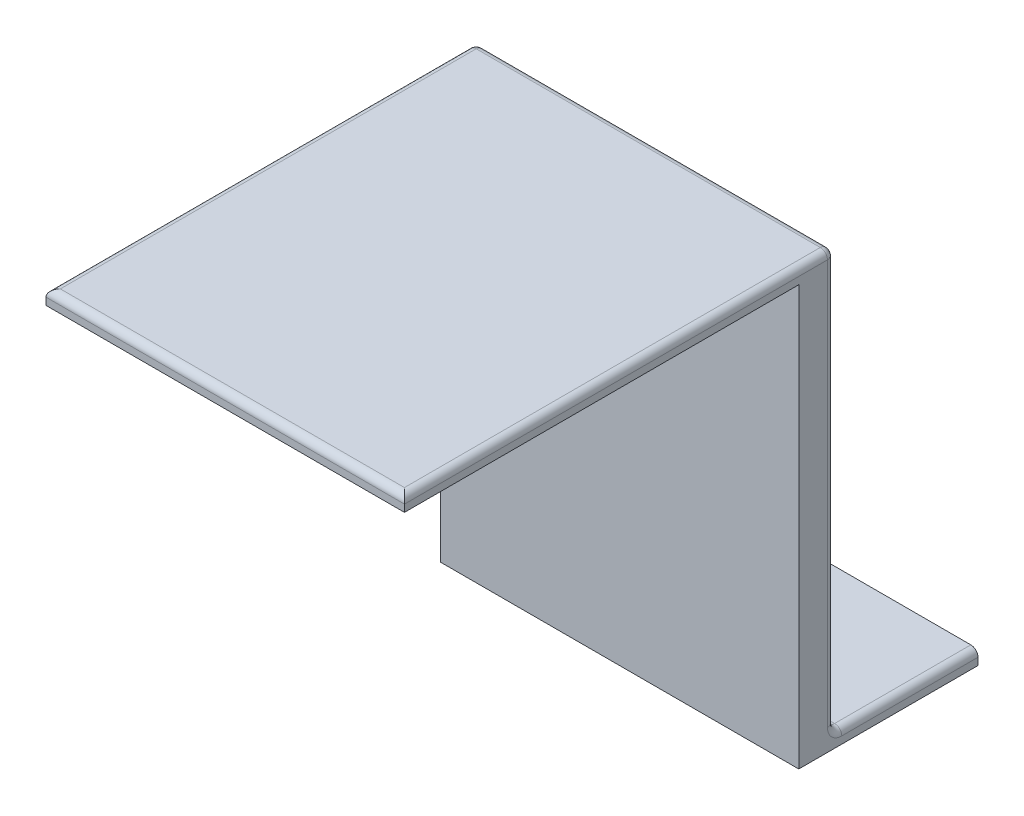
ISO-10303-21;
HEADER;
FILE_DESCRIPTION(('STEP AP214'),'2;1');
FILE_NAME('part.step','',(''),(''),'','','');
FILE_SCHEMA(('AUTOMOTIVE_DESIGN { 1 0 10303 214 1 1 1 1 }'));
ENDSEC;
DATA;
#1=APPLICATION_CONTEXT('core data for automotive mechanical design processes');
#2=APPLICATION_PROTOCOL_DEFINITION('international standard','automotive_design',2000,#1);
#3=PRODUCT_CONTEXT('',#1,'mechanical');
#4=PRODUCT('Part','Part','',(#3));
#5=PRODUCT_RELATED_PRODUCT_CATEGORY('part','',(#4));
#6=PRODUCT_DEFINITION_FORMATION('','',#4);
#7=PRODUCT_DEFINITION_CONTEXT('part definition',#1,'design');
#8=PRODUCT_DEFINITION('design','',#6,#7);
#9=PRODUCT_DEFINITION_SHAPE('','',#8);
#10=(LENGTH_UNIT() NAMED_UNIT(*) SI_UNIT(.MILLI.,.METRE.));
#11=(NAMED_UNIT(*) PLANE_ANGLE_UNIT() SI_UNIT($,.RADIAN.));
#12=(NAMED_UNIT(*) SI_UNIT($,.STERADIAN.) SOLID_ANGLE_UNIT());
#13=UNCERTAINTY_MEASURE_WITH_UNIT(LENGTH_MEASURE(1.E-05),#10,'distance_accuracy_value','');
#14=(GEOMETRIC_REPRESENTATION_CONTEXT(3) GLOBAL_UNCERTAINTY_ASSIGNED_CONTEXT((#13)) GLOBAL_UNIT_ASSIGNED_CONTEXT((#10,
#11,#12)) REPRESENTATION_CONTEXT('',''));
#15=CARTESIAN_POINT('',(0.,0.,0.));
#16=DIRECTION('',(0.,0.,1.));
#17=DIRECTION('',(1.,0.,0.));
#18=AXIS2_PLACEMENT_3D('',#15,#16,#17);
#19=CARTESIAN_POINT('',(0.,0.,0.));
#20=DIRECTION('',(0.,0.,1.));
#21=DIRECTION('',(1.,0.,0.));
#22=AXIS2_PLACEMENT_3D('',#19,#20,#21);
#23=PLANE('',#22);
#24=DIRECTION('',(0.,1.,0.));
#25=VECTOR('',#24,1.);
#26=CARTESIAN_POINT('',(52.3909090909091,0.,0.));
#27=LINE('',#26,#25);
#28=CARTESIAN_POINT('',(52.3909090909091,29.8655354534217,0.));
#29=VERTEX_POINT('',#28);
#30=CARTESIAN_POINT('',(52.3909090909092,-66.1844645465783,0.));
#31=VERTEX_POINT('',#30);
#32=EDGE_CURVE('E230',#29,#31,#27,.F.);
#33=ORIENTED_EDGE('',*,*,#32,.T.);
#34=DIRECTION('',(1.,0.,0.));
#35=VECTOR('',#34,1.);
#36=CARTESIAN_POINT('',(-30.9090909090908,-66.1844645465783,0.));
#37=LINE('',#36,#35);
#38=CARTESIAN_POINT('',(-29.2090909090908,-66.1844645465783,0.));
#39=VERTEX_POINT('',#38);
#40=EDGE_CURVE('E233',#31,#39,#37,.F.);
#41=ORIENTED_EDGE('',*,*,#40,.T.);
#42=DIRECTION('',(0.,-1.,0.));
#43=VECTOR('',#42,1.);
#44=CARTESIAN_POINT('',(-29.2090909090909,0.,0.));
#45=LINE('',#44,#43);
#46=CARTESIAN_POINT('',(-29.2090909090909,29.8655354534217,0.));
#47=VERTEX_POINT('',#46);
#48=EDGE_CURVE('E228',#39,#47,#45,.F.);
#49=ORIENTED_EDGE('',*,*,#48,.T.);
#50=DIRECTION('',(-1.,0.,0.));
#51=VECTOR('',#50,1.);
#52=CARTESIAN_POINT('',(0.,29.8655354534217,0.));
#53=LINE('',#52,#51);
#54=EDGE_CURVE('E226',#47,#29,#53,.F.);
#55=ORIENTED_EDGE('',*,*,#54,.T.);
#56=EDGE_LOOP('',(#33,#41,#49,#55));
#57=FACE_BOUND('',#56,.T.);
#58=ADVANCED_FACE('F38',(#57),#23,.F.);
#59=CARTESIAN_POINT('',(-30.9090909090908,-71.2844645465783,102.));
#60=DIRECTION('',(0.,1.,0.));
#61=DIRECTION('',(0.,0.,1.));
#62=AXIS2_PLACEMENT_3D('',#59,#60,#61);
#63=PLANE('',#62);
#64=DIRECTION('',(1.,0.,0.));
#65=VECTOR('',#64,1.);
#66=CARTESIAN_POINT('',(54.0909090909092,-71.2844645465783,8.49999999999999));
#67=LINE('',#66,#65);
#68=CARTESIAN_POINT('',(-30.9090909090909,-71.2844645465783,8.49999999999999));
#69=VERTEX_POINT('',#68);
#70=CARTESIAN_POINT('',(54.0909090909092,-71.2844645465783,8.49999999999999));
#71=VERTEX_POINT('',#70);
#72=EDGE_CURVE('E187',#69,#71,#67,.T.);
#73=ORIENTED_EDGE('',*,*,#72,.F.);
#74=DIRECTION('',(0.,0.,-1.));
#75=VECTOR('',#74,1.);
#76=CARTESIAN_POINT('',(-30.9090909090908,-71.2844645465783,102.));
#77=LINE('',#76,#75);
#78=CARTESIAN_POINT('',(-30.9090909090908,-71.2844645465783,-34.));
#79=VERTEX_POINT('',#78);
#80=EDGE_CURVE('E170',#69,#79,#77,.T.);
#81=ORIENTED_EDGE('',*,*,#80,.T.);
#82=DIRECTION('',(-1.,0.,0.));
#83=VECTOR('',#82,1.);
#84=CARTESIAN_POINT('',(-30.9090909090908,-71.2844645465783,-34.));
#85=LINE('',#84,#83);
#86=CARTESIAN_POINT('',(54.0909090909092,-71.2844645465783,-34.));
#87=VERTEX_POINT('',#86);
#88=EDGE_CURVE('E152',#87,#79,#85,.T.);
#89=ORIENTED_EDGE('',*,*,#88,.F.);
#90=DIRECTION('',(0.,0.,-1.));
#91=VECTOR('',#90,1.);
#92=CARTESIAN_POINT('',(54.0909090909092,-71.2844645465783,102.));
#93=LINE('',#92,#91);
#94=EDGE_CURVE('E163',#71,#87,#93,.T.);
#95=ORIENTED_EDGE('',*,*,#94,.F.);
#96=EDGE_LOOP('',(#73,#81,#89,#95));
#97=FACE_BOUND('',#96,.T.);
#98=ADVANCED_FACE('F173',(#97),#63,.F.);
#99=CARTESIAN_POINT('',(-30.9090909090909,31.5655354534217,102.));
#100=DIRECTION('',(1.,0.,0.));
#101=DIRECTION('',(0.,1.,0.));
#102=AXIS2_PLACEMENT_3D('',#99,#100,#101);
#103=PLANE('',#102);
#104=CARTESIAN_POINT('',(-30.9090909090908,-66.1844645465783,-1.7));
#105=DIRECTION('',(1.,0.,0.));
#106=DIRECTION('',(0.,1.,0.));
#107=AXIS2_PLACEMENT_3D('',#104,#105,#106);
#108=CIRCLE('',#107,3.4);
#109=CARTESIAN_POINT('',(-30.9090909090908,-69.5844645465783,-1.7));
#110=VERTEX_POINT('',#109);
#111=CARTESIAN_POINT('',(-30.9090909090908,-66.1844645465783,1.7));
#112=VERTEX_POINT('',#111);
#113=EDGE_CURVE('E221',#110,#112,#108,.F.);
#114=ORIENTED_EDGE('',*,*,#113,.F.);
#115=DIRECTION('',(0.,0.,1.));
#116=VECTOR('',#115,1.);
#117=CARTESIAN_POINT('',(-30.9090909090908,-69.5844645465783,102.));
#118=LINE('',#117,#116);
#119=CARTESIAN_POINT('',(-30.9090909090908,-69.5844645465783,-34.));
#120=VERTEX_POINT('',#119);
#121=EDGE_CURVE('E224',#110,#120,#118,.F.);
#122=ORIENTED_EDGE('',*,*,#121,.T.);
#123=DIRECTION('',(0.,1.,0.));
#124=VECTOR('',#123,1.);
#125=CARTESIAN_POINT('',(-30.9090909090908,-71.2844645465783,-34.));
#126=LINE('',#125,#124);
#127=EDGE_CURVE('E279',#79,#120,#126,.T.);
#128=ORIENTED_EDGE('',*,*,#127,.F.);
#129=ORIENTED_EDGE('',*,*,#80,.F.);
#130=DIRECTION('',(0.,-1.,0.));
#131=VECTOR('',#130,1.);
#132=CARTESIAN_POINT('',(-30.9090909090909,-71.2844645465783,8.49999999999999));
#133=LINE('',#132,#131);
#134=CARTESIAN_POINT('',(-30.9090909090909,28.1655354534217,8.49999999999999));
#135=VERTEX_POINT('',#134);
#136=EDGE_CURVE('E185',#135,#69,#133,.T.);
#137=ORIENTED_EDGE('',*,*,#136,.F.);
#138=DIRECTION('',(0.,0.,1.));
#139=VECTOR('',#138,1.);
#140=CARTESIAN_POINT('',(-30.9090909090909,28.1655354534217,8.49999999999999));
#141=LINE('',#140,#139);
#142=CARTESIAN_POINT('',(-30.9090909090909,28.1655354534217,102.));
#143=VERTEX_POINT('',#142);
#144=EDGE_CURVE('E190',#135,#143,#141,.T.);
#145=ORIENTED_EDGE('',*,*,#144,.T.);
#146=DIRECTION('',(0.,-1.,0.));
#147=VECTOR('',#146,1.);
#148=CARTESIAN_POINT('',(-30.9090909090909,31.5655354534217,102.));
#149=LINE('',#148,#147);
#150=CARTESIAN_POINT('',(-30.9090909090909,29.8655354534217,102.));
#151=VERTEX_POINT('',#150);
#152=EDGE_CURVE('E193',#151,#143,#149,.T.);
#153=ORIENTED_EDGE('',*,*,#152,.F.);
#154=DIRECTION('',(0.,0.,-1.));
#155=VECTOR('',#154,1.);
#156=CARTESIAN_POINT('',(-30.9090909090909,29.8655354534217,102.));
#157=LINE('',#156,#155);
#158=CARTESIAN_POINT('',(-30.9090909090909,29.8655354534217,1.7));
#159=VERTEX_POINT('',#158);
#160=EDGE_CURVE('E217',#151,#159,#157,.T.);
#161=ORIENTED_EDGE('',*,*,#160,.T.);
#162=DIRECTION('',(0.,-1.,0.));
#163=VECTOR('',#162,1.);
#164=CARTESIAN_POINT('',(-30.9090909090909,31.5655354534217,1.7));
#165=LINE('',#164,#163);
#166=EDGE_CURVE('E219',#159,#112,#165,.T.);
#167=ORIENTED_EDGE('',*,*,#166,.T.);
#168=EDGE_LOOP('',(#114,#122,#128,#129,#137,#145,#153,#161,#167));
#169=FACE_BOUND('',#168,.T.);
#170=ADVANCED_FACE('F338',(#169),#103,.F.);
#171=CARTESIAN_POINT('',(54.0909090909091,31.5655354534217,102.));
#172=DIRECTION('',(-1.,0.,0.));
#173=DIRECTION('',(0.,-1.,0.));
#174=AXIS2_PLACEMENT_3D('',#171,#172,#173);
#175=PLANE('',#174);
#176=DIRECTION('',(0.,-1.,0.));
#177=VECTOR('',#176,1.);
#178=CARTESIAN_POINT('',(54.0909090909092,-71.2844645465783,-34.));
#179=LINE('',#178,#177);
#180=CARTESIAN_POINT('',(54.0909090909092,-69.5844645465783,-34.));
#181=VERTEX_POINT('',#180);
#182=EDGE_CURVE('E146',#181,#87,#179,.T.);
#183=ORIENTED_EDGE('',*,*,#182,.F.);
#184=DIRECTION('',(0.,0.,1.));
#185=VECTOR('',#184,1.);
#186=CARTESIAN_POINT('',(54.0909090909092,-69.5844645465783,102.));
#187=LINE('',#186,#185);
#188=CARTESIAN_POINT('',(54.0909090909092,-69.5844645465783,-1.7));
#189=VERTEX_POINT('',#188);
#190=EDGE_CURVE('E206',#181,#189,#187,.T.);
#191=ORIENTED_EDGE('',*,*,#190,.T.);
#192=CARTESIAN_POINT('',(54.0909090909092,-66.1844645465783,-1.7));
#193=DIRECTION('',(-1.,0.,0.));
#194=DIRECTION('',(0.,-1.,0.));
#195=AXIS2_PLACEMENT_3D('',#192,#193,#194);
#196=CIRCLE('',#195,3.4);
#197=CARTESIAN_POINT('',(54.0909090909092,-66.1844645465783,1.7));
#198=VERTEX_POINT('',#197);
#199=EDGE_CURVE('E203',#198,#189,#196,.F.);
#200=ORIENTED_EDGE('',*,*,#199,.F.);
#201=DIRECTION('',(0.,1.,0.));
#202=VECTOR('',#201,1.);
#203=CARTESIAN_POINT('',(54.0909090909091,31.5655354534217,1.7));
#204=LINE('',#203,#202);
#205=CARTESIAN_POINT('',(54.0909090909091,29.8655354534217,1.7));
#206=VERTEX_POINT('',#205);
#207=EDGE_CURVE('E201',#198,#206,#204,.T.);
#208=ORIENTED_EDGE('',*,*,#207,.T.);
#209=DIRECTION('',(0.,0.,-1.));
#210=VECTOR('',#209,1.);
#211=CARTESIAN_POINT('',(54.0909090909091,29.8655354534217,102.));
#212=LINE('',#211,#210);
#213=CARTESIAN_POINT('',(54.0909090909091,29.8655354534217,102.));
#214=VERTEX_POINT('',#213);
#215=EDGE_CURVE('E199',#206,#214,#212,.F.);
#216=ORIENTED_EDGE('',*,*,#215,.T.);
#217=DIRECTION('',(0.,1.,0.));
#218=VECTOR('',#217,1.);
#219=CARTESIAN_POINT('',(54.0909090909091,31.5655354534217,102.));
#220=LINE('',#219,#218);
#221=CARTESIAN_POINT('',(54.0909090909091,28.1655354534217,102.));
#222=VERTEX_POINT('',#221);
#223=EDGE_CURVE('E171',#222,#214,#220,.T.);
#224=ORIENTED_EDGE('',*,*,#223,.F.);
#225=DIRECTION('',(0.,0.,1.));
#226=VECTOR('',#225,1.);
#227=CARTESIAN_POINT('',(54.0909090909092,28.1655354534217,8.49999999999999));
#228=LINE('',#227,#226);
#229=CARTESIAN_POINT('',(54.0909090909092,28.1655354534217,8.49999999999999));
#230=VERTEX_POINT('',#229);
#231=EDGE_CURVE('E188',#230,#222,#228,.T.);
#232=ORIENTED_EDGE('',*,*,#231,.F.);
#233=DIRECTION('',(0.,1.,0.));
#234=VECTOR('',#233,1.);
#235=CARTESIAN_POINT('',(54.0909090909092,-71.2844645465783,8.49999999999999));
#236=LINE('',#235,#234);
#237=EDGE_CURVE('E167',#71,#230,#236,.T.);
#238=ORIENTED_EDGE('',*,*,#237,.F.);
#239=ORIENTED_EDGE('',*,*,#94,.T.);
#240=EDGE_LOOP('',(#183,#191,#200,#208,#216,#224,#232,#238,#239));
#241=FACE_BOUND('',#240,.T.);
#242=ADVANCED_FACE('F164',(#241),#175,.F.);
#243=CARTESIAN_POINT('',(-30.9090909090909,31.5655354534217,102.));
#244=DIRECTION('',(0.,-1.,0.));
#245=DIRECTION('',(0.,0.,-1.));
#246=AXIS2_PLACEMENT_3D('',#243,#244,#245);
#247=PLANE('',#246);
#248=DIRECTION('',(-1.,0.,0.));
#249=VECTOR('',#248,1.);
#250=CARTESIAN_POINT('',(54.0909090909091,31.5655354534217,100.3));
#251=LINE('',#250,#249);
#252=CARTESIAN_POINT('',(-29.2090909090909,31.5655354534217,100.3));
#253=VERTEX_POINT('',#252);
#254=CARTESIAN_POINT('',(52.3909090909091,31.5655354534217,100.3));
#255=VERTEX_POINT('',#254);
#256=EDGE_CURVE('E55',#253,#255,#251,.F.);
#257=ORIENTED_EDGE('',*,*,#256,.T.);
#258=DIRECTION('',(0.,0.,-1.));
#259=VECTOR('',#258,1.);
#260=CARTESIAN_POINT('',(52.3909090909091,31.5655354534217,102.));
#261=LINE('',#260,#259);
#262=CARTESIAN_POINT('',(52.3909090909091,31.5655354534217,1.7));
#263=VERTEX_POINT('',#262);
#264=EDGE_CURVE('E47',#255,#263,#261,.T.);
#265=ORIENTED_EDGE('',*,*,#264,.T.);
#266=DIRECTION('',(-1.,0.,0.));
#267=VECTOR('',#266,1.);
#268=CARTESIAN_POINT('',(-30.9090909090909,31.5655354534217,1.7));
#269=LINE('',#268,#267);
#270=CARTESIAN_POINT('',(-29.2090909090909,31.5655354534217,1.7));
#271=VERTEX_POINT('',#270);
#272=EDGE_CURVE('E235',#263,#271,#269,.T.);
#273=ORIENTED_EDGE('',*,*,#272,.T.);
#274=DIRECTION('',(0.,0.,-1.));
#275=VECTOR('',#274,1.);
#276=CARTESIAN_POINT('',(-29.2090909090909,31.5655354534217,102.));
#277=LINE('',#276,#275);
#278=EDGE_CURVE('E60',#271,#253,#277,.F.);
#279=ORIENTED_EDGE('',*,*,#278,.T.);
#280=EDGE_LOOP('',(#257,#265,#273,#279));
#281=FACE_BOUND('',#280,.T.);
#282=ADVANCED_FACE('F343',(#281),#247,.F.);
#283=CARTESIAN_POINT('',(0.,0.,102.));
#284=DIRECTION('',(0.,0.,1.));
#285=DIRECTION('',(1.,0.,0.));
#286=AXIS2_PLACEMENT_3D('',#283,#284,#285);
#287=PLANE('',#286);
#288=ORIENTED_EDGE('',*,*,#223,.T.);
#289=DIRECTION('',(-1.,0.,0.));
#290=VECTOR('',#289,1.);
#291=CARTESIAN_POINT('',(-30.9090909090909,29.8655354534217,102.));
#292=LINE('',#291,#290);
#293=EDGE_CURVE('E11',#214,#151,#292,.T.);
#294=ORIENTED_EDGE('',*,*,#293,.T.);
#295=ORIENTED_EDGE('',*,*,#152,.T.);
#296=DIRECTION('',(-1.,0.,0.));
#297=VECTOR('',#296,1.);
#298=CARTESIAN_POINT('',(54.0909090909092,28.1655354534217,102.));
#299=LINE('',#298,#297);
#300=EDGE_CURVE('E175',#222,#143,#299,.T.);
#301=ORIENTED_EDGE('',*,*,#300,.F.);
#302=EDGE_LOOP('',(#288,#294,#295,#301));
#303=FACE_BOUND('',#302,.T.);
#304=ADVANCED_FACE('F322',(#303),#287,.T.);
#305=CARTESIAN_POINT('',(54.0909090909092,28.1655354534217,8.49999999999999));
#306=DIRECTION('',(0.,1.,0.));
#307=DIRECTION('',(-1.,0.,0.));
#308=AXIS2_PLACEMENT_3D('',#305,#306,#307);
#309=PLANE('',#308);
#310=ORIENTED_EDGE('',*,*,#300,.T.);
#311=ORIENTED_EDGE('',*,*,#144,.F.);
#312=DIRECTION('',(-1.,0.,0.));
#313=VECTOR('',#312,1.);
#314=CARTESIAN_POINT('',(54.0909090909092,28.1655354534217,8.49999999999999));
#315=LINE('',#314,#313);
#316=EDGE_CURVE('E182',#230,#135,#315,.T.);
#317=ORIENTED_EDGE('',*,*,#316,.F.);
#318=ORIENTED_EDGE('',*,*,#231,.T.);
#319=EDGE_LOOP('',(#310,#311,#317,#318));
#320=FACE_BOUND('',#319,.T.);
#321=ADVANCED_FACE('F504',(#320),#309,.F.);
#322=CARTESIAN_POINT('',(0.,0.,8.49999999999999));
#323=DIRECTION('',(0.,0.,1.));
#324=DIRECTION('',(1.,0.,0.));
#325=AXIS2_PLACEMENT_3D('',#322,#323,#324);
#326=PLANE('',#325);
#327=ORIENTED_EDGE('',*,*,#237,.T.);
#328=ORIENTED_EDGE('',*,*,#316,.T.);
#329=ORIENTED_EDGE('',*,*,#136,.T.);
#330=ORIENTED_EDGE('',*,*,#72,.T.);
#331=EDGE_LOOP('',(#327,#328,#329,#330));
#332=FACE_BOUND('',#331,.T.);
#333=ADVANCED_FACE('F465',(#332),#326,.T.);
#334=CARTESIAN_POINT('',(-30.9090909090908,-67.8844645465783,-34.));
#335=DIRECTION('',(0.,-1.,0.));
#336=DIRECTION('',(1.,0.,0.));
#337=AXIS2_PLACEMENT_3D('',#334,#335,#336);
#338=PLANE('',#337);
#339=DIRECTION('',(1.,0.,0.));
#340=VECTOR('',#339,1.);
#341=CARTESIAN_POINT('',(54.0909090909092,-67.8844645465783,-1.7));
#342=LINE('',#341,#340);
#343=CARTESIAN_POINT('',(-29.2090909090908,-67.8844645465783,-1.7));
#344=VERTEX_POINT('',#343);
#345=CARTESIAN_POINT('',(52.3909090909092,-67.8844645465783,-1.7));
#346=VERTEX_POINT('',#345);
#347=EDGE_CURVE('E208',#344,#346,#342,.T.);
#348=ORIENTED_EDGE('',*,*,#347,.T.);
#349=DIRECTION('',(0.,0.,1.));
#350=VECTOR('',#349,1.);
#351=CARTESIAN_POINT('',(52.3909090909092,-67.8844645465783,-34.));
#352=LINE('',#351,#350);
#353=CARTESIAN_POINT('',(52.3909090909092,-67.8844645465783,-34.));
#354=VERTEX_POINT('',#353);
#355=EDGE_CURVE('E212',#346,#354,#352,.F.);
#356=ORIENTED_EDGE('',*,*,#355,.T.);
#357=DIRECTION('',(1.,0.,0.));
#358=VECTOR('',#357,1.);
#359=CARTESIAN_POINT('',(-30.9090909090908,-67.8844645465783,-34.));
#360=LINE('',#359,#358);
#361=CARTESIAN_POINT('',(-29.2090909090908,-67.8844645465783,-34.));
#362=VERTEX_POINT('',#361);
#363=EDGE_CURVE('E159',#362,#354,#360,.T.);
#364=ORIENTED_EDGE('',*,*,#363,.F.);
#365=DIRECTION('',(0.,0.,1.));
#366=VECTOR('',#365,1.);
#367=CARTESIAN_POINT('',(-29.2090909090908,-67.8844645465783,-34.));
#368=LINE('',#367,#366);
#369=EDGE_CURVE('E210',#362,#344,#368,.T.);
#370=ORIENTED_EDGE('',*,*,#369,.T.);
#371=EDGE_LOOP('',(#348,#356,#364,#370));
#372=FACE_BOUND('',#371,.T.);
#373=ADVANCED_FACE('F457',(#372),#338,.F.);
#374=CARTESIAN_POINT('',(0.,0.,-34.));
#375=DIRECTION('',(0.,0.,-1.));
#376=DIRECTION('',(-1.,0.,0.));
#377=AXIS2_PLACEMENT_3D('',#374,#375,#376);
#378=PLANE('',#377);
#379=ORIENTED_EDGE('',*,*,#363,.T.);
#380=CARTESIAN_POINT('',(52.3909090909092,-69.5844645465783,-34.));
#381=DIRECTION('',(0.,0.,-1.));
#382=DIRECTION('',(-1.,0.,0.));
#383=AXIS2_PLACEMENT_3D('',#380,#381,#382);
#384=CIRCLE('',#383,1.7);
#385=EDGE_CURVE('E155',#354,#181,#384,.T.);
#386=ORIENTED_EDGE('',*,*,#385,.T.);
#387=ORIENTED_EDGE('',*,*,#182,.T.);
#388=ORIENTED_EDGE('',*,*,#88,.T.);
#389=ORIENTED_EDGE('',*,*,#127,.T.);
#390=CARTESIAN_POINT('',(-29.2090909090908,-69.5844645465783,-34.));
#391=DIRECTION('',(0.,0.,-1.));
#392=DIRECTION('',(-1.,0.,0.));
#393=AXIS2_PLACEMENT_3D('',#390,#391,#392);
#394=CIRCLE('',#393,1.7);
#395=EDGE_CURVE('E214',#120,#362,#394,.T.);
#396=ORIENTED_EDGE('',*,*,#395,.T.);
#397=EDGE_LOOP('',(#379,#386,#387,#388,#389,#396));
#398=FACE_BOUND('',#397,.T.);
#399=ADVANCED_FACE('F149',(#398),#378,.T.);
#400=CARTESIAN_POINT('',(-29.2090909090909,29.8655354534217,102.));
#401=DIRECTION('',(0.,0.,-1.));
#402=DIRECTION('',(-1.,0.,0.));
#403=AXIS2_PLACEMENT_3D('',#400,#401,#402);
#404=CYLINDRICAL_SURFACE('',#403,1.7);
#405=CARTESIAN_POINT('',(-29.2090909090909,29.8655354534217,1.7));
#406=DIRECTION('',(0.,0.,-1.));
#407=DIRECTION('',(-1.,0.,0.));
#408=AXIS2_PLACEMENT_3D('',#405,#406,#407);
#409=CIRCLE('',#408,1.7);
#410=EDGE_CURVE('E272',#159,#271,#409,.T.);
#411=ORIENTED_EDGE('',*,*,#410,.F.);
#412=ORIENTED_EDGE('',*,*,#160,.F.);
#413=CARTESIAN_POINT('',(-29.2090909090909,29.8655354534217,100.3));
#414=DIRECTION('',(-0.707106781186547,0.,-0.707106781186547));
#415=DIRECTION('',(0.707106781186547,0.,-0.707106781186547));
#416=AXIS2_PLACEMENT_3D('',#413,#414,#415);
#417=ELLIPSE('',#416,2.40416305603426,1.7);
#418=EDGE_CURVE('E42',#253,#151,#417,.F.);
#419=ORIENTED_EDGE('',*,*,#418,.F.);
#420=ORIENTED_EDGE('',*,*,#278,.F.);
#421=EDGE_LOOP('',(#411,#412,#419,#420));
#422=FACE_BOUND('',#421,.T.);
#423=ADVANCED_FACE('F40',(#422),#404,.T.);
#424=CARTESIAN_POINT('',(0.,29.8655354534217,100.3));
#425=DIRECTION('',(1.,0.,0.));
#426=DIRECTION('',(0.,0.,-1.));
#427=AXIS2_PLACEMENT_3D('',#424,#425,#426);
#428=CYLINDRICAL_SURFACE('',#427,1.7);
#429=ORIENTED_EDGE('',*,*,#418,.T.);
#430=ORIENTED_EDGE('',*,*,#293,.F.);
#431=CARTESIAN_POINT('',(52.3909090909091,29.8655354534217,100.3));
#432=DIRECTION('',(0.707106781186547,0.,-0.707106781186547));
#433=DIRECTION('',(0.707106781186547,0.,0.707106781186547));
#434=AXIS2_PLACEMENT_3D('',#431,#432,#433);
#435=ELLIPSE('',#434,2.40416305603426,1.7);
#436=EDGE_CURVE('E270',#255,#214,#435,.T.);
#437=ORIENTED_EDGE('',*,*,#436,.F.);
#438=ORIENTED_EDGE('',*,*,#256,.F.);
#439=EDGE_LOOP('',(#429,#430,#437,#438));
#440=FACE_BOUND('',#439,.T.);
#441=ADVANCED_FACE('F324',(#440),#428,.T.);
#442=CARTESIAN_POINT('',(-29.2090909090909,29.8655354534217,1.7));
#443=DIRECTION('',(0.,1.,0.));
#444=DIRECTION('',(0.,0.,1.));
#445=AXIS2_PLACEMENT_3D('',#442,#443,#444);
#446=SPHERICAL_SURFACE('',#445,1.7);
#447=CARTESIAN_POINT('',(-29.2090909090909,29.8655354534217,1.7));
#448=DIRECTION('',(0.,1.,0.));
#449=DIRECTION('',(0.,0.,1.));
#450=AXIS2_PLACEMENT_3D('',#447,#448,#449);
#451=CIRCLE('',#450,1.7);
#452=EDGE_CURVE('E264',#159,#47,#451,.F.);
#453=ORIENTED_EDGE('',*,*,#452,.F.);
#454=ORIENTED_EDGE('',*,*,#410,.T.);
#455=CARTESIAN_POINT('',(-29.2090909090909,29.8655354534217,1.7));
#456=DIRECTION('',(-1.,0.,0.));
#457=DIRECTION('',(0.,0.,1.));
#458=AXIS2_PLACEMENT_3D('',#455,#456,#457);
#459=CIRCLE('',#458,1.7);
#460=EDGE_CURVE('E267',#47,#271,#459,.F.);
#461=ORIENTED_EDGE('',*,*,#460,.F.);
#462=EDGE_LOOP('',(#453,#454,#461));
#463=FACE_BOUND('',#462,.T.);
#464=ADVANCED_FACE('F326',(#463),#446,.T.);
#465=CARTESIAN_POINT('',(52.3909090909091,29.8655354534217,102.));
#466=DIRECTION('',(0.,0.,-1.));
#467=DIRECTION('',(-1.,0.,0.));
#468=AXIS2_PLACEMENT_3D('',#465,#466,#467);
#469=CYLINDRICAL_SURFACE('',#468,1.7);
#470=ORIENTED_EDGE('',*,*,#436,.T.);
#471=ORIENTED_EDGE('',*,*,#215,.F.);
#472=CARTESIAN_POINT('',(52.3909090909091,29.8655354534217,1.7));
#473=DIRECTION('',(0.,0.,-1.));
#474=DIRECTION('',(-1.,0.,0.));
#475=AXIS2_PLACEMENT_3D('',#472,#473,#474);
#476=CIRCLE('',#475,1.7);
#477=EDGE_CURVE('E261',#263,#206,#476,.T.);
#478=ORIENTED_EDGE('',*,*,#477,.F.);
#479=ORIENTED_EDGE('',*,*,#264,.F.);
#480=EDGE_LOOP('',(#470,#471,#478,#479));
#481=FACE_BOUND('',#480,.T.);
#482=ADVANCED_FACE('F318',(#481),#469,.T.);
#483=CARTESIAN_POINT('',(-30.9090909090909,29.8655354534217,1.7));
#484=DIRECTION('',(-1.,0.,0.));
#485=DIRECTION('',(0.,0.,1.));
#486=AXIS2_PLACEMENT_3D('',#483,#484,#485);
#487=CYLINDRICAL_SURFACE('',#486,1.7);
#488=ORIENTED_EDGE('',*,*,#460,.T.);
#489=ORIENTED_EDGE('',*,*,#272,.F.);
#490=CARTESIAN_POINT('',(52.3909090909091,29.8655354534217,1.7));
#491=DIRECTION('',(1.,0.,0.));
#492=DIRECTION('',(0.,0.,-1.));
#493=AXIS2_PLACEMENT_3D('',#490,#491,#492);
#494=CIRCLE('',#493,1.7);
#495=EDGE_CURVE('E259',#29,#263,#494,.T.);
#496=ORIENTED_EDGE('',*,*,#495,.F.);
#497=ORIENTED_EDGE('',*,*,#54,.F.);
#498=EDGE_LOOP('',(#488,#489,#496,#497));
#499=FACE_BOUND('',#498,.T.);
#500=ADVANCED_FACE('F312',(#499),#487,.T.);
#501=CARTESIAN_POINT('',(-29.2090909090909,31.5655354534217,1.7));
#502=DIRECTION('',(0.,-1.,0.));
#503=DIRECTION('',(1.,0.,0.));
#504=AXIS2_PLACEMENT_3D('',#501,#502,#503);
#505=CYLINDRICAL_SURFACE('',#504,1.7);
#506=ORIENTED_EDGE('',*,*,#452,.T.);
#507=ORIENTED_EDGE('',*,*,#48,.F.);
#508=CARTESIAN_POINT('',(-29.2090909090908,-66.1844645465783,1.7));
#509=DIRECTION('',(0.,-1.,0.));
#510=DIRECTION('',(0.,0.,-1.));
#511=AXIS2_PLACEMENT_3D('',#508,#509,#510);
#512=CIRCLE('',#511,1.7);
#513=EDGE_CURVE('E256',#112,#39,#512,.T.);
#514=ORIENTED_EDGE('',*,*,#513,.F.);
#515=ORIENTED_EDGE('',*,*,#166,.F.);
#516=EDGE_LOOP('',(#506,#507,#514,#515));
#517=FACE_BOUND('',#516,.T.);
#518=ADVANCED_FACE('F368',(#517),#505,.T.);
#519=CARTESIAN_POINT('',(-29.2090909090908,-69.5844645465783,-34.));
#520=DIRECTION('',(0.,0.,1.));
#521=DIRECTION('',(1.,0.,0.));
#522=AXIS2_PLACEMENT_3D('',#519,#520,#521);
#523=CYLINDRICAL_SURFACE('',#522,1.7);
#524=ORIENTED_EDGE('',*,*,#395,.F.);
#525=ORIENTED_EDGE('',*,*,#121,.F.);
#526=CARTESIAN_POINT('',(-29.2090909090908,-69.5844645465783,-1.7));
#527=DIRECTION('',(0.,0.,1.));
#528=DIRECTION('',(1.,0.,0.));
#529=AXIS2_PLACEMENT_3D('',#526,#527,#528);
#530=CIRCLE('',#529,1.7);
#531=EDGE_CURVE('E253',#344,#110,#530,.T.);
#532=ORIENTED_EDGE('',*,*,#531,.F.);
#533=ORIENTED_EDGE('',*,*,#369,.F.);
#534=EDGE_LOOP('',(#524,#525,#532,#533));
#535=FACE_BOUND('',#534,.T.);
#536=ADVANCED_FACE('F365',(#535),#523,.T.);
#537=CARTESIAN_POINT('',(52.3909090909091,29.8655354534217,1.7));
#538=DIRECTION('',(0.,1.,0.));
#539=DIRECTION('',(0.,0.,1.));
#540=AXIS2_PLACEMENT_3D('',#537,#538,#539);
#541=SPHERICAL_SURFACE('',#540,1.7);
#542=ORIENTED_EDGE('',*,*,#495,.T.);
#543=ORIENTED_EDGE('',*,*,#477,.T.);
#544=CARTESIAN_POINT('',(52.3909090909091,29.8655354534217,1.7));
#545=DIRECTION('',(0.,1.,0.));
#546=DIRECTION('',(0.,0.,1.));
#547=AXIS2_PLACEMENT_3D('',#544,#545,#546);
#548=CIRCLE('',#547,1.7);
#549=EDGE_CURVE('E250',#29,#206,#548,.F.);
#550=ORIENTED_EDGE('',*,*,#549,.F.);
#551=EDGE_LOOP('',(#542,#543,#550));
#552=FACE_BOUND('',#551,.T.);
#553=ADVANCED_FACE('F315',(#552),#541,.T.);
#554=CARTESIAN_POINT('',(-29.2090909090908,-66.1844645465783,-1.7));
#555=DIRECTION('',(1.,0.,0.));
#556=DIRECTION('',(0.,1.,0.));
#557=AXIS2_PLACEMENT_3D('',#554,#555,#556);
#558=TOROIDAL_SURFACE('',#557,3.4,1.7);
#559=ORIENTED_EDGE('',*,*,#113,.T.);
#560=ORIENTED_EDGE('',*,*,#513,.T.);
#561=CARTESIAN_POINT('',(-29.2090909090908,-66.1844645465783,-1.7));
#562=DIRECTION('',(1.,0.,0.));
#563=DIRECTION('',(0.,1.,0.));
#564=AXIS2_PLACEMENT_3D('',#561,#562,#563);
#565=CIRCLE('',#564,1.7);
#566=EDGE_CURVE('E247',#344,#39,#565,.F.);
#567=ORIENTED_EDGE('',*,*,#566,.F.);
#568=ORIENTED_EDGE('',*,*,#531,.T.);
#569=EDGE_LOOP('',(#559,#560,#567,#568));
#570=FACE_BOUND('',#569,.T.);
#571=ADVANCED_FACE('F359',(#570),#558,.T.);
#572=CARTESIAN_POINT('',(52.3909090909091,31.5655354534217,1.7));
#573=DIRECTION('',(0.,1.,0.));
#574=DIRECTION('',(-1.,0.,0.));
#575=AXIS2_PLACEMENT_3D('',#572,#573,#574);
#576=CYLINDRICAL_SURFACE('',#575,1.7);
#577=ORIENTED_EDGE('',*,*,#549,.T.);
#578=ORIENTED_EDGE('',*,*,#207,.F.);
#579=CARTESIAN_POINT('',(52.3909090909092,-66.1844645465783,1.7));
#580=DIRECTION('',(0.,-1.,0.));
#581=DIRECTION('',(0.,0.,-1.));
#582=AXIS2_PLACEMENT_3D('',#579,#580,#581);
#583=CIRCLE('',#582,1.7);
#584=EDGE_CURVE('E244',#31,#198,#583,.T.);
#585=ORIENTED_EDGE('',*,*,#584,.F.);
#586=ORIENTED_EDGE('',*,*,#32,.F.);
#587=EDGE_LOOP('',(#577,#578,#585,#586));
#588=FACE_BOUND('',#587,.T.);
#589=ADVANCED_FACE('F296',(#588),#576,.T.);
#590=CARTESIAN_POINT('',(-30.9090909090908,-66.1844645465783,-1.7));
#591=DIRECTION('',(-1.,0.,0.));
#592=DIRECTION('',(0.,-1.,0.));
#593=AXIS2_PLACEMENT_3D('',#590,#591,#592);
#594=CYLINDRICAL_SURFACE('',#593,1.7);
#595=ORIENTED_EDGE('',*,*,#566,.T.);
#596=ORIENTED_EDGE('',*,*,#40,.F.);
#597=CARTESIAN_POINT('',(52.3909090909091,-66.1844645465783,-1.7));
#598=DIRECTION('',(-1.,0.,0.));
#599=DIRECTION('',(0.,-1.,0.));
#600=AXIS2_PLACEMENT_3D('',#597,#598,#599);
#601=CIRCLE('',#600,1.7);
#602=EDGE_CURVE('E242',#346,#31,#601,.T.);
#603=ORIENTED_EDGE('',*,*,#602,.F.);
#604=ORIENTED_EDGE('',*,*,#347,.F.);
#605=EDGE_LOOP('',(#595,#596,#603,#604));
#606=FACE_BOUND('',#605,.T.);
#607=ADVANCED_FACE('F304',(#606),#594,.F.);
#608=CARTESIAN_POINT('',(52.3909090909091,-66.1844645465783,-1.7));
#609=DIRECTION('',(-1.,0.,0.));
#610=DIRECTION('',(0.,-1.,0.));
#611=AXIS2_PLACEMENT_3D('',#608,#609,#610);
#612=TOROIDAL_SURFACE('',#611,3.4,1.7);
#613=ORIENTED_EDGE('',*,*,#584,.T.);
#614=ORIENTED_EDGE('',*,*,#199,.T.);
#615=CARTESIAN_POINT('',(52.3909090909092,-69.5844645465783,-1.7));
#616=DIRECTION('',(0.,0.,1.));
#617=DIRECTION('',(1.,0.,0.));
#618=AXIS2_PLACEMENT_3D('',#615,#616,#617);
#619=CIRCLE('',#618,1.7);
#620=EDGE_CURVE('E240',#346,#189,#619,.F.);
#621=ORIENTED_EDGE('',*,*,#620,.F.);
#622=ORIENTED_EDGE('',*,*,#602,.T.);
#623=EDGE_LOOP('',(#613,#614,#621,#622));
#624=FACE_BOUND('',#623,.T.);
#625=ADVANCED_FACE('F300',(#624),#612,.T.);
#626=CARTESIAN_POINT('',(52.3909090909092,-69.5844645465783,102.));
#627=DIRECTION('',(0.,0.,1.));
#628=DIRECTION('',(1.,0.,0.));
#629=AXIS2_PLACEMENT_3D('',#626,#627,#628);
#630=CYLINDRICAL_SURFACE('',#629,1.7);
#631=ORIENTED_EDGE('',*,*,#385,.F.);
#632=ORIENTED_EDGE('',*,*,#355,.F.);
#633=ORIENTED_EDGE('',*,*,#620,.T.);
#634=ORIENTED_EDGE('',*,*,#190,.F.);
#635=EDGE_LOOP('',(#631,#632,#633,#634));
#636=FACE_BOUND('',#635,.T.);
#637=ADVANCED_FACE('F289',(#636),#630,.T.);
#638=CLOSED_SHELL('',(#58,#98,#170,#242,#282,#304,#321,#333,#373,#399,#423,#441,#464,#482,#500,
#518,#536,#553,#571,#589,#607,#625,#637));
#639=MANIFOLD_SOLID_BREP('B2',#638);
#640=ADVANCED_BREP_SHAPE_REPRESENTATION('',(#18,#639),#14);
#641=SHAPE_DEFINITION_REPRESENTATION(#9,#640);
ENDSEC;
END-ISO-10303-21;
